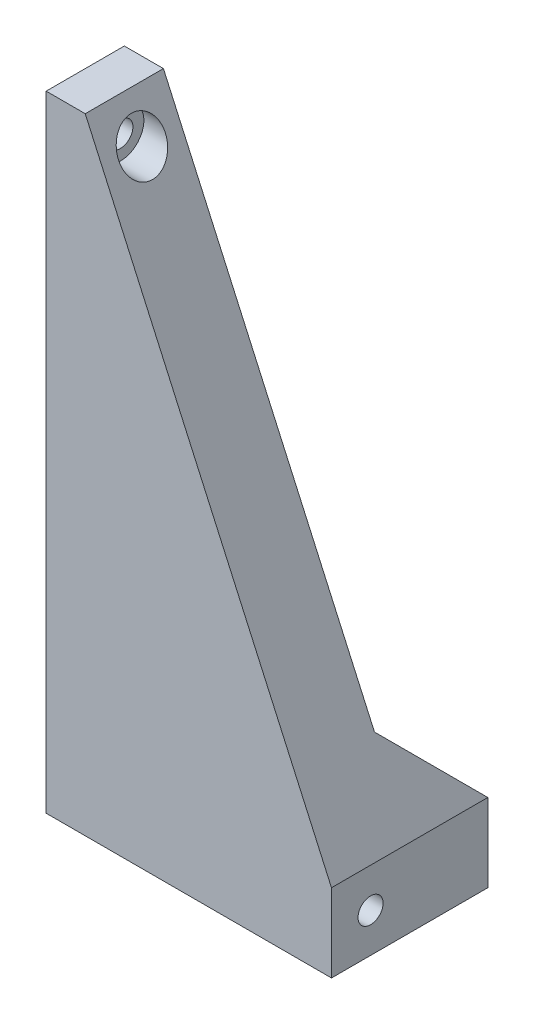
ISO-10303-21;
HEADER;
FILE_DESCRIPTION(('STEP AP214'),'2;1');
FILE_NAME('part.step','',(''),(''),'','','');
FILE_SCHEMA(('AUTOMOTIVE_DESIGN { 1 0 10303 214 1 1 1 1 }'));
ENDSEC;
DATA;
#1=APPLICATION_CONTEXT('core data for automotive mechanical design processes');
#2=APPLICATION_PROTOCOL_DEFINITION('international standard','automotive_design',2000,#1);
#3=PRODUCT_CONTEXT('',#1,'mechanical');
#4=PRODUCT('Part','Part','',(#3));
#5=PRODUCT_RELATED_PRODUCT_CATEGORY('part','',(#4));
#6=PRODUCT_DEFINITION_FORMATION('','',#4);
#7=PRODUCT_DEFINITION_CONTEXT('part definition',#1,'design');
#8=PRODUCT_DEFINITION('design','',#6,#7);
#9=PRODUCT_DEFINITION_SHAPE('','',#8);
#10=(LENGTH_UNIT() NAMED_UNIT(*) SI_UNIT(.MILLI.,.METRE.));
#11=(NAMED_UNIT(*) PLANE_ANGLE_UNIT() SI_UNIT($,.RADIAN.));
#12=(NAMED_UNIT(*) SI_UNIT($,.STERADIAN.) SOLID_ANGLE_UNIT());
#13=UNCERTAINTY_MEASURE_WITH_UNIT(LENGTH_MEASURE(1.E-05),#10,'distance_accuracy_value','');
#14=(GEOMETRIC_REPRESENTATION_CONTEXT(3) GLOBAL_UNCERTAINTY_ASSIGNED_CONTEXT((#13)) GLOBAL_UNIT_ASSIGNED_CONTEXT((#10,
#11,#12)) REPRESENTATION_CONTEXT('',''));
#15=CARTESIAN_POINT('',(0.,0.,0.));
#16=DIRECTION('',(0.,0.,1.));
#17=DIRECTION('',(1.,0.,0.));
#18=AXIS2_PLACEMENT_3D('',#15,#16,#17);
#19=CARTESIAN_POINT('',(28.900000000001,80.,-4.99999999999997));
#20=DIRECTION('',(0.,-1.,0.));
#21=DIRECTION('',(1.,0.,0.));
#22=AXIS2_PLACEMENT_3D('',#19,#20,#21);
#23=CYLINDRICAL_SURFACE('',#22,1.6);
#24=CARTESIAN_POINT('',(28.900000000001,0.,-4.99999999999997));
#25=DIRECTION('',(0.,-1.,0.));
#26=DIRECTION('',(1.,0.,0.));
#27=AXIS2_PLACEMENT_3D('',#24,#25,#26);
#28=CIRCLE('',#27,1.6);
#29=CARTESIAN_POINT('',(30.500000000001,0.,-4.99999999999997));
#30=VERTEX_POINT('',#29);
#31=EDGE_CURVE('E147',#30,#30,#28,.T.);
#32=ORIENTED_EDGE('',*,*,#31,.T.);
#33=EDGE_LOOP('',(#32));
#34=FACE_BOUND('',#33,.T.);
#35=CARTESIAN_POINT('',(28.900000000001,13.,-4.99999999999997));
#36=DIRECTION('',(0.,1.,0.));
#37=DIRECTION('',(0.,0.,1.));
#38=AXIS2_PLACEMENT_3D('',#35,#36,#37);
#39=CIRCLE('',#38,1.6);
#40=CARTESIAN_POINT('',(28.900000000001,13.,-3.39999999999997));
#41=VERTEX_POINT('',#40);
#42=EDGE_CURVE('E148',#41,#41,#39,.F.);
#43=ORIENTED_EDGE('',*,*,#42,.F.);
#44=EDGE_LOOP('',(#43));
#45=FACE_BOUND('',#44,.T.);
#46=ADVANCED_FACE('F35',(#34,#45),#23,.F.);
#47=CARTESIAN_POINT('',(0.,75.,5.));
#48=DIRECTION('',(1.,0.,0.));
#49=DIRECTION('',(0.,0.,-1.));
#50=AXIS2_PLACEMENT_3D('',#47,#48,#49);
#51=CYLINDRICAL_SURFACE('',#50,1.6);
#52=CARTESIAN_POINT('',(0.,75.,5.));
#53=DIRECTION('',(1.,0.,0.));
#54=DIRECTION('',(0.,0.,-1.));
#55=AXIS2_PLACEMENT_3D('',#52,#53,#54);
#56=CIRCLE('',#55,1.6);
#57=CARTESIAN_POINT('',(0.,75.,3.4));
#58=VERTEX_POINT('',#57);
#59=EDGE_CURVE('E160',#58,#58,#56,.T.);
#60=ORIENTED_EDGE('',*,*,#59,.F.);
#61=EDGE_LOOP('',(#60));
#62=FACE_BOUND('',#61,.T.);
#63=CARTESIAN_POINT('',(4.5,75.,5.));
#64=DIRECTION('',(1.,0.,0.));
#65=DIRECTION('',(0.,0.,-1.));
#66=AXIS2_PLACEMENT_3D('',#63,#64,#65);
#67=CIRCLE('',#66,1.6);
#68=CARTESIAN_POINT('',(4.5,75.,3.4));
#69=VERTEX_POINT('',#68);
#70=EDGE_CURVE('E141',#69,#69,#67,.F.);
#71=ORIENTED_EDGE('',*,*,#70,.F.);
#72=EDGE_LOOP('',(#71));
#73=FACE_BOUND('',#72,.T.);
#74=ADVANCED_FACE('F212',(#62,#73),#51,.F.);
#75=CARTESIAN_POINT('',(36.5,0.,10.));
#76=DIRECTION('',(0.,1.,0.));
#77=DIRECTION('',(-1.,0.,0.));
#78=AXIS2_PLACEMENT_3D('',#75,#76,#77);
#79=PLANE('',#78);
#80=ORIENTED_EDGE('',*,*,#31,.F.);
#81=EDGE_LOOP('',(#80));
#82=FACE_BOUND('',#81,.T.);
#83=DIRECTION('',(0.,0.,-1.));
#84=VECTOR('',#83,1.);
#85=CARTESIAN_POINT('',(0.,0.,10.));
#86=LINE('',#85,#84);
#87=CARTESIAN_POINT('',(0.,0.,10.));
#88=VERTEX_POINT('',#87);
#89=CARTESIAN_POINT('',(0.,0.,-10.));
#90=VERTEX_POINT('',#89);
#91=EDGE_CURVE('E120',#88,#90,#86,.T.);
#92=ORIENTED_EDGE('',*,*,#91,.T.);
#93=DIRECTION('',(-1.,0.,0.));
#94=VECTOR('',#93,1.);
#95=CARTESIAN_POINT('',(36.5,0.,-10.));
#96=LINE('',#95,#94);
#97=CARTESIAN_POINT('',(36.5,0.,-10.));
#98=VERTEX_POINT('',#97);
#99=EDGE_CURVE('E172',#98,#90,#96,.T.);
#100=ORIENTED_EDGE('',*,*,#99,.F.);
#101=DIRECTION('',(0.,0.,-1.));
#102=VECTOR('',#101,1.);
#103=CARTESIAN_POINT('',(36.5,0.,10.));
#104=LINE('',#103,#102);
#105=CARTESIAN_POINT('',(36.5,0.,10.));
#106=VERTEX_POINT('',#105);
#107=EDGE_CURVE('E135',#106,#98,#104,.T.);
#108=ORIENTED_EDGE('',*,*,#107,.F.);
#109=DIRECTION('',(1.,0.,0.));
#110=VECTOR('',#109,1.);
#111=CARTESIAN_POINT('',(36.5,0.,10.));
#112=LINE('',#111,#110);
#113=EDGE_CURVE('E125',#88,#106,#112,.T.);
#114=ORIENTED_EDGE('',*,*,#113,.F.);
#115=EDGE_LOOP('',(#92,#100,#108,#114));
#116=FACE_BOUND('',#115,.T.);
#117=ADVANCED_FACE('F198',(#82,#116),#79,.F.);
#118=CARTESIAN_POINT('',(36.5,10.,10.));
#119=DIRECTION('',(-1.,0.,0.));
#120=DIRECTION('',(0.,0.,1.));
#121=AXIS2_PLACEMENT_3D('',#118,#119,#120);
#122=PLANE('',#121);
#123=CARTESIAN_POINT('',(36.5,5.,5.));
#124=DIRECTION('',(1.,0.,0.));
#125=DIRECTION('',(0.,0.,-1.));
#126=AXIS2_PLACEMENT_3D('',#123,#124,#125);
#127=CIRCLE('',#126,1.6);
#128=CARTESIAN_POINT('',(36.5,5.,3.4));
#129=VERTEX_POINT('',#128);
#130=EDGE_CURVE('E165',#129,#129,#127,.T.);
#131=ORIENTED_EDGE('',*,*,#130,.F.);
#132=EDGE_LOOP('',(#131));
#133=FACE_BOUND('',#132,.T.);
#134=ORIENTED_EDGE('',*,*,#107,.T.);
#135=DIRECTION('',(0.,-1.,0.));
#136=VECTOR('',#135,1.);
#137=CARTESIAN_POINT('',(36.5,10.,-10.));
#138=LINE('',#137,#136);
#139=CARTESIAN_POINT('',(36.5,10.,-10.));
#140=VERTEX_POINT('',#139);
#141=EDGE_CURVE('E164',#140,#98,#138,.T.);
#142=ORIENTED_EDGE('',*,*,#141,.F.);
#143=DIRECTION('',(0.,0.,-1.));
#144=VECTOR('',#143,1.);
#145=CARTESIAN_POINT('',(36.5,10.,10.));
#146=LINE('',#145,#144);
#147=CARTESIAN_POINT('',(36.5,10.,10.));
#148=VERTEX_POINT('',#147);
#149=EDGE_CURVE('E70',#148,#140,#146,.T.);
#150=ORIENTED_EDGE('',*,*,#149,.F.);
#151=DIRECTION('',(0.,1.,0.));
#152=VECTOR('',#151,1.);
#153=CARTESIAN_POINT('',(36.5,10.,10.));
#154=LINE('',#153,#152);
#155=EDGE_CURVE('E128',#106,#148,#154,.T.);
#156=ORIENTED_EDGE('',*,*,#155,.F.);
#157=EDGE_LOOP('',(#134,#142,#150,#156));
#158=FACE_BOUND('',#157,.T.);
#159=ADVANCED_FACE('F192',(#133,#158),#122,.F.);
#160=CARTESIAN_POINT('',(5.,80.,10.));
#161=DIRECTION('',(-0.911921505175107,-0.410364677328798,0.));
#162=DIRECTION('',(0.410364677328798,-0.911921505175107,0.));
#163=AXIS2_PLACEMENT_3D('',#160,#161,#162);
#164=PLANE('',#163);
#165=CARTESIAN_POINT('',(7.25,75.,5.));
#166=DIRECTION('',(-0.911921505175107,-0.410364677328798,0.));
#167=DIRECTION('',(0.410364677328798,-0.911921505175107,0.));
#168=AXIS2_PLACEMENT_3D('',#165,#166,#167);
#169=ELLIPSE('',#168,3.2897568299192,3.);
#170=CARTESIAN_POINT('',(8.6,72.,5.));
#171=VERTEX_POINT('',#170);
#172=EDGE_CURVE('E144',#171,#171,#169,.T.);
#173=ORIENTED_EDGE('',*,*,#172,.T.);
#174=EDGE_LOOP('',(#173));
#175=FACE_BOUND('',#174,.T.);
#176=ORIENTED_EDGE('',*,*,#149,.T.);
#177=DIRECTION('',(-0.303217704238144,0.673817120529208,0.67381712052921));
#178=VECTOR('',#177,1.);
#179=CARTESIAN_POINT('',(15.2156640181612,57.2985244040862,37.2985244040863));
#180=LINE('',#179,#178);
#181=CARTESIAN_POINT('',(32.,20.,0.));
#182=VERTEX_POINT('',#181);
#183=EDGE_CURVE('E59',#140,#182,#180,.T.);
#184=ORIENTED_EDGE('',*,*,#183,.T.);
#185=DIRECTION('',(-0.410364677328798,0.911921505175107,0.));
#186=VECTOR('',#185,1.);
#187=CARTESIAN_POINT('',(5.,80.,0.));
#188=LINE('',#187,#186);
#189=CARTESIAN_POINT('',(5.,80.,0.));
#190=VERTEX_POINT('',#189);
#191=EDGE_CURVE('E115',#182,#190,#188,.T.);
#192=ORIENTED_EDGE('',*,*,#191,.T.);
#193=DIRECTION('',(0.,0.,-1.));
#194=VECTOR('',#193,1.);
#195=CARTESIAN_POINT('',(5.,80.,10.));
#196=LINE('',#195,#194);
#197=CARTESIAN_POINT('',(5.,80.,10.));
#198=VERTEX_POINT('',#197);
#199=EDGE_CURVE('E111',#198,#190,#196,.T.);
#200=ORIENTED_EDGE('',*,*,#199,.F.);
#201=DIRECTION('',(-0.410364677328798,0.911921505175107,0.));
#202=VECTOR('',#201,1.);
#203=CARTESIAN_POINT('',(5.,80.,10.));
#204=LINE('',#203,#202);
#205=EDGE_CURVE('E181',#148,#198,#204,.T.);
#206=ORIENTED_EDGE('',*,*,#205,.F.);
#207=EDGE_LOOP('',(#176,#184,#192,#200,#206));
#208=FACE_BOUND('',#207,.T.);
#209=ADVANCED_FACE('F185',(#175,#208),#164,.F.);
#210=CARTESIAN_POINT('',(0.,80.,10.));
#211=DIRECTION('',(0.,-1.,0.));
#212=DIRECTION('',(0.,0.,-1.));
#213=AXIS2_PLACEMENT_3D('',#210,#211,#212);
#214=PLANE('',#213);
#215=DIRECTION('',(-1.,0.,0.));
#216=VECTOR('',#215,1.);
#217=CARTESIAN_POINT('',(0.,80.,0.));
#218=LINE('',#217,#216);
#219=CARTESIAN_POINT('',(0.,80.,0.));
#220=VERTEX_POINT('',#219);
#221=EDGE_CURVE('E104',#190,#220,#218,.T.);
#222=ORIENTED_EDGE('',*,*,#221,.T.);
#223=DIRECTION('',(0.,0.,-1.));
#224=VECTOR('',#223,1.);
#225=CARTESIAN_POINT('',(0.,80.,10.));
#226=LINE('',#225,#224);
#227=CARTESIAN_POINT('',(0.,80.,10.));
#228=VERTEX_POINT('',#227);
#229=EDGE_CURVE('E108',#228,#220,#226,.T.);
#230=ORIENTED_EDGE('',*,*,#229,.F.);
#231=DIRECTION('',(-1.,0.,0.));
#232=VECTOR('',#231,1.);
#233=CARTESIAN_POINT('',(0.,80.,10.));
#234=LINE('',#233,#232);
#235=EDGE_CURVE('E183',#198,#228,#234,.T.);
#236=ORIENTED_EDGE('',*,*,#235,.F.);
#237=ORIENTED_EDGE('',*,*,#199,.T.);
#238=EDGE_LOOP('',(#222,#230,#236,#237));
#239=FACE_BOUND('',#238,.T.);
#240=ADVANCED_FACE('F106',(#239),#214,.F.);
#241=CARTESIAN_POINT('',(0.,0.,10.));
#242=DIRECTION('',(1.,0.,0.));
#243=DIRECTION('',(0.,0.,-1.));
#244=AXIS2_PLACEMENT_3D('',#241,#242,#243);
#245=PLANE('',#244);
#246=CARTESIAN_POINT('',(0.,5.,5.));
#247=DIRECTION('',(1.,0.,0.));
#248=DIRECTION('',(0.,0.,-1.));
#249=AXIS2_PLACEMENT_3D('',#246,#247,#248);
#250=CIRCLE('',#249,1.6);
#251=CARTESIAN_POINT('',(0.,5.,3.4));
#252=VERTEX_POINT('',#251);
#253=EDGE_CURVE('E161',#252,#252,#250,.T.);
#254=ORIENTED_EDGE('',*,*,#253,.T.);
#255=EDGE_LOOP('',(#254));
#256=FACE_BOUND('',#255,.T.);
#257=ORIENTED_EDGE('',*,*,#59,.T.);
#258=EDGE_LOOP('',(#257));
#259=FACE_BOUND('',#258,.T.);
#260=DIRECTION('',(0.,-1.,0.));
#261=VECTOR('',#260,1.);
#262=CARTESIAN_POINT('',(0.,0.,0.));
#263=LINE('',#262,#261);
#264=CARTESIAN_POINT('',(0.,20.,0.));
#265=VERTEX_POINT('',#264);
#266=EDGE_CURVE('E114',#220,#265,#263,.T.);
#267=ORIENTED_EDGE('',*,*,#266,.T.);
#268=DIRECTION('',(0.,-0.707106781186546,-0.707106781186549));
#269=VECTOR('',#268,1.);
#270=CARTESIAN_POINT('',(0.,15.,-4.99999999999997));
#271=LINE('',#270,#269);
#272=CARTESIAN_POINT('',(0.,10.,-10.));
#273=VERTEX_POINT('',#272);
#274=EDGE_CURVE('E44',#265,#273,#271,.T.);
#275=ORIENTED_EDGE('',*,*,#274,.T.);
#276=DIRECTION('',(0.,1.,0.));
#277=VECTOR('',#276,1.);
#278=CARTESIAN_POINT('',(0.,10.,-10.));
#279=LINE('',#278,#277);
#280=EDGE_CURVE('E175',#90,#273,#279,.T.);
#281=ORIENTED_EDGE('',*,*,#280,.F.);
#282=ORIENTED_EDGE('',*,*,#91,.F.);
#283=DIRECTION('',(0.,-1.,0.));
#284=VECTOR('',#283,1.);
#285=CARTESIAN_POINT('',(0.,0.,10.));
#286=LINE('',#285,#284);
#287=EDGE_CURVE('E119',#228,#88,#286,.T.);
#288=ORIENTED_EDGE('',*,*,#287,.F.);
#289=ORIENTED_EDGE('',*,*,#229,.T.);
#290=EDGE_LOOP('',(#267,#275,#281,#282,#288,#289));
#291=FACE_BOUND('',#290,.T.);
#292=ADVANCED_FACE('F117',(#256,#259,#291),#245,.F.);
#293=CARTESIAN_POINT('',(0.,0.,10.));
#294=DIRECTION('',(0.,0.,-1.));
#295=DIRECTION('',(-1.,0.,0.));
#296=AXIS2_PLACEMENT_3D('',#293,#294,#295);
#297=PLANE('',#296);
#298=ORIENTED_EDGE('',*,*,#113,.T.);
#299=ORIENTED_EDGE('',*,*,#155,.T.);
#300=ORIENTED_EDGE('',*,*,#205,.T.);
#301=ORIENTED_EDGE('',*,*,#235,.T.);
#302=ORIENTED_EDGE('',*,*,#287,.T.);
#303=EDGE_LOOP('',(#298,#299,#300,#301,#302));
#304=FACE_BOUND('',#303,.T.);
#305=ADVANCED_FACE('F200',(#304),#297,.F.);
#306=CARTESIAN_POINT('',(0.,0.,0.));
#307=DIRECTION('',(0.,0.,-1.));
#308=DIRECTION('',(-1.,0.,0.));
#309=AXIS2_PLACEMENT_3D('',#306,#307,#308);
#310=PLANE('',#309);
#311=ORIENTED_EDGE('',*,*,#191,.F.);
#312=DIRECTION('',(-1.,0.,0.));
#313=VECTOR('',#312,1.);
#314=CARTESIAN_POINT('',(0.,20.,0.));
#315=LINE('',#314,#313);
#316=EDGE_CURVE('E124',#182,#265,#315,.T.);
#317=ORIENTED_EDGE('',*,*,#316,.T.);
#318=ORIENTED_EDGE('',*,*,#266,.F.);
#319=ORIENTED_EDGE('',*,*,#221,.F.);
#320=EDGE_LOOP('',(#311,#317,#318,#319));
#321=FACE_BOUND('',#320,.T.);
#322=ADVANCED_FACE('F122',(#321),#310,.T.);
#323=CARTESIAN_POINT('',(0.,0.,-10.));
#324=DIRECTION('',(0.,0.,-1.));
#325=DIRECTION('',(-1.,0.,0.));
#326=AXIS2_PLACEMENT_3D('',#323,#324,#325);
#327=PLANE('',#326);
#328=ORIENTED_EDGE('',*,*,#141,.T.);
#329=ORIENTED_EDGE('',*,*,#99,.T.);
#330=ORIENTED_EDGE('',*,*,#280,.T.);
#331=DIRECTION('',(1.,0.,0.));
#332=VECTOR('',#331,1.);
#333=CARTESIAN_POINT('',(36.5,10.,-10.));
#334=LINE('',#333,#332);
#335=EDGE_CURVE('E177',#273,#140,#334,.T.);
#336=ORIENTED_EDGE('',*,*,#335,.T.);
#337=EDGE_LOOP('',(#328,#329,#330,#336));
#338=FACE_BOUND('',#337,.T.);
#339=ADVANCED_FACE('F190',(#338),#327,.T.);
#340=CARTESIAN_POINT('',(36.5,10.,-10.));
#341=DIRECTION('',(0.,-0.707106781186549,0.707106781186546));
#342=DIRECTION('',(1.,0.,0.));
#343=AXIS2_PLACEMENT_3D('',#340,#341,#342);
#344=PLANE('',#343);
#345=DIRECTION('',(-1.,0.,0.));
#346=VECTOR('',#345,1.);
#347=CARTESIAN_POINT('',(36.5,13.,-6.99999999999999));
#348=LINE('',#347,#346);
#349=CARTESIAN_POINT('',(31.1360679775008,13.,-6.99999999999999));
#350=VERTEX_POINT('',#349);
#351=CARTESIAN_POINT('',(26.6639320225012,13.,-6.99999999999999));
#352=VERTEX_POINT('',#351);
#353=EDGE_CURVE('E150',#350,#352,#348,.T.);
#354=ORIENTED_EDGE('',*,*,#353,.F.);
#355=CARTESIAN_POINT('',(28.900000000001,15.,-4.99999999999997));
#356=DIRECTION('',(0.,-0.707106781186549,0.707106781186546));
#357=DIRECTION('',(0.,0.707106781186546,0.707106781186549));
#358=AXIS2_PLACEMENT_3D('',#355,#356,#357);
#359=ELLIPSE('',#358,4.24264068711928,3.);
#360=EDGE_CURVE('E11',#350,#352,#359,.T.);
#361=ORIENTED_EDGE('',*,*,#360,.T.);
#362=EDGE_LOOP('',(#354,#361));
#363=FACE_BOUND('',#362,.T.);
#364=ORIENTED_EDGE('',*,*,#274,.F.);
#365=ORIENTED_EDGE('',*,*,#316,.F.);
#366=ORIENTED_EDGE('',*,*,#183,.F.);
#367=ORIENTED_EDGE('',*,*,#335,.F.);
#368=EDGE_LOOP('',(#364,#365,#366,#367));
#369=FACE_BOUND('',#368,.T.);
#370=ADVANCED_FACE('F38',(#363,#369),#344,.F.);
#371=CARTESIAN_POINT('',(0.,5.,5.));
#372=DIRECTION('',(1.,0.,0.));
#373=DIRECTION('',(0.,0.,-1.));
#374=AXIS2_PLACEMENT_3D('',#371,#372,#373);
#375=CYLINDRICAL_SURFACE('',#374,1.6);
#376=ORIENTED_EDGE('',*,*,#253,.F.);
#377=EDGE_LOOP('',(#376));
#378=FACE_BOUND('',#377,.T.);
#379=ORIENTED_EDGE('',*,*,#130,.T.);
#380=EDGE_LOOP('',(#379));
#381=FACE_BOUND('',#380,.T.);
#382=ADVANCED_FACE('F225',(#378,#381),#375,.F.);
#383=CARTESIAN_POINT('',(4.5,75.,5.));
#384=DIRECTION('',(1.,0.,0.));
#385=DIRECTION('',(0.,0.,-1.));
#386=AXIS2_PLACEMENT_3D('',#383,#384,#385);
#387=CYLINDRICAL_SURFACE('',#386,3.);
#388=CARTESIAN_POINT('',(4.5,75.,5.));
#389=DIRECTION('',(1.,0.,0.));
#390=DIRECTION('',(0.,0.,-1.));
#391=AXIS2_PLACEMENT_3D('',#388,#389,#390);
#392=CIRCLE('',#391,3.);
#393=CARTESIAN_POINT('',(4.5,75.,2.));
#394=VERTEX_POINT('',#393);
#395=EDGE_CURVE('E145',#394,#394,#392,.T.);
#396=ORIENTED_EDGE('',*,*,#395,.F.);
#397=EDGE_LOOP('',(#396));
#398=FACE_BOUND('',#397,.T.);
#399=ORIENTED_EDGE('',*,*,#172,.F.);
#400=EDGE_LOOP('',(#399));
#401=FACE_BOUND('',#400,.T.);
#402=ADVANCED_FACE('F223',(#398,#401),#387,.F.);
#403=CARTESIAN_POINT('',(4.5,75.,5.));
#404=DIRECTION('',(1.,0.,0.));
#405=DIRECTION('',(0.,0.,-1.));
#406=AXIS2_PLACEMENT_3D('',#403,#404,#405);
#407=PLANE('',#406);
#408=ORIENTED_EDGE('',*,*,#395,.T.);
#409=EDGE_LOOP('',(#408));
#410=FACE_BOUND('',#409,.T.);
#411=ORIENTED_EDGE('',*,*,#70,.T.);
#412=EDGE_LOOP('',(#411));
#413=FACE_BOUND('',#412,.T.);
#414=ADVANCED_FACE('F241',(#410,#413),#407,.T.);
#415=CARTESIAN_POINT('',(28.900000000001,13.,-4.99999999999997));
#416=DIRECTION('',(0.,1.,0.));
#417=DIRECTION('',(0.,0.,1.));
#418=AXIS2_PLACEMENT_3D('',#415,#416,#417);
#419=CYLINDRICAL_SURFACE('',#418,3.);
#420=CARTESIAN_POINT('',(28.900000000001,13.,-4.99999999999997));
#421=DIRECTION('',(0.,1.,0.));
#422=DIRECTION('',(0.,0.,1.));
#423=AXIS2_PLACEMENT_3D('',#420,#421,#422);
#424=CIRCLE('',#423,3.);
#425=EDGE_CURVE('E50',#352,#350,#424,.T.);
#426=ORIENTED_EDGE('',*,*,#425,.F.);
#427=ORIENTED_EDGE('',*,*,#360,.F.);
#428=EDGE_LOOP('',(#426,#427));
#429=FACE_BOUND('',#428,.T.);
#430=ADVANCED_FACE('F239',(#429),#419,.F.);
#431=CARTESIAN_POINT('',(28.900000000001,13.,-4.99999999999997));
#432=DIRECTION('',(0.,1.,0.));
#433=DIRECTION('',(0.,0.,1.));
#434=AXIS2_PLACEMENT_3D('',#431,#432,#433);
#435=PLANE('',#434);
#436=ORIENTED_EDGE('',*,*,#42,.T.);
#437=EDGE_LOOP('',(#436));
#438=FACE_BOUND('',#437,.T.);
#439=ORIENTED_EDGE('',*,*,#353,.T.);
#440=ORIENTED_EDGE('',*,*,#425,.T.);
#441=EDGE_LOOP('',(#439,#440));
#442=FACE_BOUND('',#441,.T.);
#443=ADVANCED_FACE('F236',(#438,#442),#435,.T.);
#444=CLOSED_SHELL('',(#46,#74,#117,#159,#209,#240,#292,#305,#322,#339,#370,#382,#402,#414,#430,#443));
#445=MANIFOLD_SOLID_BREP('B2',#444);
#446=ADVANCED_BREP_SHAPE_REPRESENTATION('',(#18,#445),#14);
#447=SHAPE_DEFINITION_REPRESENTATION(#9,#446);
ENDSEC;
END-ISO-10303-21;
